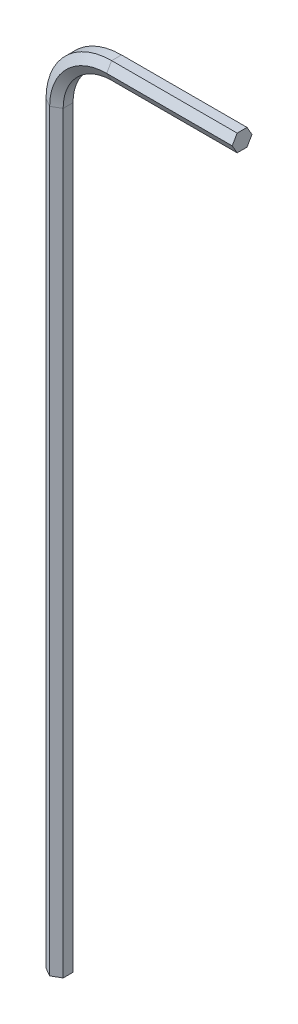
ISO-10303-21;
HEADER;
FILE_DESCRIPTION(('STEP AP214'),'2;1');
FILE_NAME('part.step','',(''),(''),'','','');
FILE_SCHEMA(('AUTOMOTIVE_DESIGN { 1 0 10303 214 1 1 1 1 }'));
ENDSEC;
DATA;
#1=APPLICATION_CONTEXT('core data for automotive mechanical design processes');
#2=APPLICATION_PROTOCOL_DEFINITION('international standard','automotive_design',2000,#1);
#3=PRODUCT_CONTEXT('',#1,'mechanical');
#4=PRODUCT('Part','Part','',(#3));
#5=PRODUCT_RELATED_PRODUCT_CATEGORY('part','',(#4));
#6=PRODUCT_DEFINITION_FORMATION('','',#4);
#7=PRODUCT_DEFINITION_CONTEXT('part definition',#1,'design');
#8=PRODUCT_DEFINITION('design','',#6,#7);
#9=PRODUCT_DEFINITION_SHAPE('','',#8);
#10=(LENGTH_UNIT() NAMED_UNIT(*) SI_UNIT(.MILLI.,.METRE.));
#11=(NAMED_UNIT(*) PLANE_ANGLE_UNIT() SI_UNIT($,.RADIAN.));
#12=(NAMED_UNIT(*) SI_UNIT($,.STERADIAN.) SOLID_ANGLE_UNIT());
#13=UNCERTAINTY_MEASURE_WITH_UNIT(LENGTH_MEASURE(1.E-05),#10,'distance_accuracy_value','');
#14=(GEOMETRIC_REPRESENTATION_CONTEXT(3) GLOBAL_UNCERTAINTY_ASSIGNED_CONTEXT((#13)) GLOBAL_UNIT_ASSIGNED_CONTEXT((#10,
#11,#12)) REPRESENTATION_CONTEXT('',''));
#15=CARTESIAN_POINT('',(0.,0.,0.));
#16=DIRECTION('',(0.,0.,1.));
#17=DIRECTION('',(1.,0.,0.));
#18=AXIS2_PLACEMENT_3D('',#15,#16,#17);
#19=CARTESIAN_POINT('',(0.,0.,0.));
#20=DIRECTION('',(0.,1.,0.));
#21=DIRECTION('',(0.,0.,1.));
#22=AXIS2_PLACEMENT_3D('',#19,#20,#21);
#23=PLANE('',#22);
#24=DIRECTION('',(0.866025403784439,0.,-0.5));
#25=VECTOR('',#24,1.);
#26=CARTESIAN_POINT('',(0.,0.,0.866025403784439));
#27=LINE('',#26,#25);
#28=CARTESIAN_POINT('',(0.,0.,0.866025403784439));
#29=VERTEX_POINT('',#28);
#30=CARTESIAN_POINT('',(0.75,0.,0.433012701892219));
#31=VERTEX_POINT('',#30);
#32=EDGE_CURVE('E183',#29,#31,#27,.T.);
#33=ORIENTED_EDGE('',*,*,#32,.F.);
#34=DIRECTION('',(0.866025403784439,0.,0.5));
#35=VECTOR('',#34,1.);
#36=CARTESIAN_POINT('',(-0.75,0.,0.433012701892219));
#37=LINE('',#36,#35);
#38=CARTESIAN_POINT('',(-0.75,0.,0.433012701892219));
#39=VERTEX_POINT('',#38);
#40=EDGE_CURVE('E225',#39,#29,#37,.T.);
#41=ORIENTED_EDGE('',*,*,#40,.F.);
#42=DIRECTION('',(0.,0.,1.));
#43=VECTOR('',#42,1.);
#44=CARTESIAN_POINT('',(-0.75,0.,-0.43301270189222));
#45=LINE('',#44,#43);
#46=CARTESIAN_POINT('',(-0.75,0.,-0.43301270189222));
#47=VERTEX_POINT('',#46);
#48=EDGE_CURVE('E212',#47,#39,#45,.T.);
#49=ORIENTED_EDGE('',*,*,#48,.F.);
#50=DIRECTION('',(-0.866025403784439,0.,0.5));
#51=VECTOR('',#50,1.);
#52=CARTESIAN_POINT('',(0.,0.,-0.866025403784439));
#53=LINE('',#52,#51);
#54=CARTESIAN_POINT('',(0.,0.,-0.866025403784439));
#55=VERTEX_POINT('',#54);
#56=EDGE_CURVE('E135',#55,#47,#53,.T.);
#57=ORIENTED_EDGE('',*,*,#56,.F.);
#58=DIRECTION('',(-0.866025403784439,0.,-0.5));
#59=VECTOR('',#58,1.);
#60=CARTESIAN_POINT('',(0.75,0.,-0.43301270189222));
#61=LINE('',#60,#59);
#62=CARTESIAN_POINT('',(0.75,0.,-0.43301270189222));
#63=VERTEX_POINT('',#62);
#64=EDGE_CURVE('E139',#63,#55,#61,.T.);
#65=ORIENTED_EDGE('',*,*,#64,.F.);
#66=DIRECTION('',(0.,0.,-1.));
#67=VECTOR('',#66,1.);
#68=CARTESIAN_POINT('',(0.75,0.,0.433012701892219));
#69=LINE('',#68,#67);
#70=EDGE_CURVE('E144',#31,#63,#69,.T.);
#71=ORIENTED_EDGE('',*,*,#70,.F.);
#72=EDGE_LOOP('',(#33,#41,#49,#57,#65,#71));
#73=FACE_BOUND('',#72,.T.);
#74=ADVANCED_FACE('F34',(#73),#23,.F.);
#75=CARTESIAN_POINT('',(16.,71.,0.));
#76=DIRECTION('',(1.,0.,0.));
#77=DIRECTION('',(0.,0.,1.));
#78=AXIS2_PLACEMENT_3D('',#75,#76,#77);
#79=PLANE('',#78);
#80=DIRECTION('',(0.,-0.866025403784439,-0.5));
#81=VECTOR('',#80,1.);
#82=CARTESIAN_POINT('',(16.,71.,0.866025403784439));
#83=LINE('',#82,#81);
#84=CARTESIAN_POINT('',(16.,71.,0.866025403784439));
#85=VERTEX_POINT('',#84);
#86=CARTESIAN_POINT('',(16.,70.25,0.433012701892219));
#87=VERTEX_POINT('',#86);
#88=EDGE_CURVE('E155',#85,#87,#83,.T.);
#89=ORIENTED_EDGE('',*,*,#88,.T.);
#90=DIRECTION('',(0.,0.,-1.));
#91=VECTOR('',#90,1.);
#92=CARTESIAN_POINT('',(16.,70.25,0.433012701892219));
#93=LINE('',#92,#91);
#94=CARTESIAN_POINT('',(16.,70.25,-0.43301270189222));
#95=VERTEX_POINT('',#94);
#96=EDGE_CURVE('E158',#87,#95,#93,.T.);
#97=ORIENTED_EDGE('',*,*,#96,.T.);
#98=DIRECTION('',(0.,0.866025403784439,-0.5));
#99=VECTOR('',#98,1.);
#100=CARTESIAN_POINT('',(16.,70.25,-0.43301270189222));
#101=LINE('',#100,#99);
#102=CARTESIAN_POINT('',(16.,71.,-0.866025403784439));
#103=VERTEX_POINT('',#102);
#104=EDGE_CURVE('E198',#95,#103,#101,.T.);
#105=ORIENTED_EDGE('',*,*,#104,.T.);
#106=DIRECTION('',(0.,0.866025403784439,0.5));
#107=VECTOR('',#106,1.);
#108=CARTESIAN_POINT('',(16.,71.,-0.866025403784439));
#109=LINE('',#108,#107);
#110=CARTESIAN_POINT('',(16.,71.75,-0.43301270189222));
#111=VERTEX_POINT('',#110);
#112=EDGE_CURVE('E53',#103,#111,#109,.T.);
#113=ORIENTED_EDGE('',*,*,#112,.T.);
#114=DIRECTION('',(0.,0.,1.));
#115=VECTOR('',#114,1.);
#116=CARTESIAN_POINT('',(16.,71.75,-0.43301270189222));
#117=LINE('',#116,#115);
#118=CARTESIAN_POINT('',(16.,71.75,0.433012701892219));
#119=VERTEX_POINT('',#118);
#120=EDGE_CURVE('E47',#111,#119,#117,.T.);
#121=ORIENTED_EDGE('',*,*,#120,.T.);
#122=DIRECTION('',(0.,-0.866025403784439,0.5));
#123=VECTOR('',#122,1.);
#124=CARTESIAN_POINT('',(16.,71.75,0.433012701892219));
#125=LINE('',#124,#123);
#126=EDGE_CURVE('E11',#119,#85,#125,.T.);
#127=ORIENTED_EDGE('',*,*,#126,.T.);
#128=EDGE_LOOP('',(#89,#97,#105,#113,#121,#127));
#129=FACE_BOUND('',#128,.T.);
#130=ADVANCED_FACE('F157',(#129),#79,.T.);
#131=CARTESIAN_POINT('',(0.,0.,0.866025403784439));
#132=DIRECTION('',(0.5,0.,0.866025403784439));
#133=DIRECTION('',(0.866025403784439,0.,-0.5));
#134=AXIS2_PLACEMENT_3D('',#131,#132,#133);
#135=PLANE('',#134);
#136=DIRECTION('',(0.,1.,0.));
#137=VECTOR('',#136,1.);
#138=CARTESIAN_POINT('',(0.75,0.,0.433012701892219));
#139=LINE('',#138,#137);
#140=CARTESIAN_POINT('',(0.75,66.,0.433012701892219));
#141=VERTEX_POINT('',#140);
#142=EDGE_CURVE('E188',#31,#141,#139,.T.);
#143=ORIENTED_EDGE('',*,*,#142,.T.);
#144=DIRECTION('',(0.866025403784439,0.,-0.5));
#145=VECTOR('',#144,1.);
#146=CARTESIAN_POINT('',(0.,66.,0.866025403784439));
#147=LINE('',#146,#145);
#148=CARTESIAN_POINT('',(0.,66.,0.866025403784439));
#149=VERTEX_POINT('',#148);
#150=EDGE_CURVE('E257',#149,#141,#147,.T.);
#151=ORIENTED_EDGE('',*,*,#150,.F.);
#152=DIRECTION('',(0.,1.,0.));
#153=VECTOR('',#152,1.);
#154=CARTESIAN_POINT('',(0.,0.,0.866025403784439));
#155=LINE('',#154,#153);
#156=EDGE_CURVE('E239',#29,#149,#155,.T.);
#157=ORIENTED_EDGE('',*,*,#156,.F.);
#158=ORIENTED_EDGE('',*,*,#32,.T.);
#159=EDGE_LOOP('',(#143,#151,#157,#158));
#160=FACE_BOUND('',#159,.T.);
#161=ADVANCED_FACE('F264',(#160),#135,.T.);
#162=CARTESIAN_POINT('',(0.75,0.,0.433012701892219));
#163=DIRECTION('',(1.,0.,0.));
#164=DIRECTION('',(0.,0.,-1.));
#165=AXIS2_PLACEMENT_3D('',#162,#163,#164);
#166=PLANE('',#165);
#167=DIRECTION('',(0.,1.,0.));
#168=VECTOR('',#167,1.);
#169=CARTESIAN_POINT('',(0.75,0.,-0.43301270189222));
#170=LINE('',#169,#168);
#171=CARTESIAN_POINT('',(0.75,66.,-0.43301270189222));
#172=VERTEX_POINT('',#171);
#173=EDGE_CURVE('E187',#63,#172,#170,.T.);
#174=ORIENTED_EDGE('',*,*,#173,.T.);
#175=DIRECTION('',(0.,0.,-1.));
#176=VECTOR('',#175,1.);
#177=CARTESIAN_POINT('',(0.75,66.,0.433012701892219));
#178=LINE('',#177,#176);
#179=EDGE_CURVE('E184',#141,#172,#178,.T.);
#180=ORIENTED_EDGE('',*,*,#179,.F.);
#181=ORIENTED_EDGE('',*,*,#142,.F.);
#182=ORIENTED_EDGE('',*,*,#70,.T.);
#183=EDGE_LOOP('',(#174,#180,#181,#182));
#184=FACE_BOUND('',#183,.T.);
#185=ADVANCED_FACE('F267',(#184),#166,.T.);
#186=CARTESIAN_POINT('',(0.75,0.,-0.43301270189222));
#187=DIRECTION('',(0.5,0.,-0.866025403784439));
#188=DIRECTION('',(-0.866025403784439,0.,-0.5));
#189=AXIS2_PLACEMENT_3D('',#186,#187,#188);
#190=PLANE('',#189);
#191=DIRECTION('',(0.,1.,0.));
#192=VECTOR('',#191,1.);
#193=CARTESIAN_POINT('',(0.,0.,-0.866025403784439));
#194=LINE('',#193,#192);
#195=CARTESIAN_POINT('',(0.,66.,-0.866025403784439));
#196=VERTEX_POINT('',#195);
#197=EDGE_CURVE('E201',#55,#196,#194,.T.);
#198=ORIENTED_EDGE('',*,*,#197,.T.);
#199=DIRECTION('',(-0.866025403784439,0.,-0.5));
#200=VECTOR('',#199,1.);
#201=CARTESIAN_POINT('',(0.75,66.,-0.43301270189222));
#202=LINE('',#201,#200);
#203=EDGE_CURVE('E191',#172,#196,#202,.T.);
#204=ORIENTED_EDGE('',*,*,#203,.F.);
#205=ORIENTED_EDGE('',*,*,#173,.F.);
#206=ORIENTED_EDGE('',*,*,#64,.T.);
#207=EDGE_LOOP('',(#198,#204,#205,#206));
#208=FACE_BOUND('',#207,.T.);
#209=ADVANCED_FACE('F321',(#208),#190,.T.);
#210=CARTESIAN_POINT('',(0.,0.,-0.866025403784439));
#211=DIRECTION('',(-0.5,0.,-0.866025403784439));
#212=DIRECTION('',(-0.866025403784439,0.,0.5));
#213=AXIS2_PLACEMENT_3D('',#210,#211,#212);
#214=PLANE('',#213);
#215=DIRECTION('',(0.,1.,0.));
#216=VECTOR('',#215,1.);
#217=CARTESIAN_POINT('',(-0.75,0.,-0.43301270189222));
#218=LINE('',#217,#216);
#219=CARTESIAN_POINT('',(-0.75,66.,-0.43301270189222));
#220=VERTEX_POINT('',#219);
#221=EDGE_CURVE('E214',#47,#220,#218,.T.);
#222=ORIENTED_EDGE('',*,*,#221,.T.);
#223=DIRECTION('',(-0.866025403784439,0.,0.5));
#224=VECTOR('',#223,1.);
#225=CARTESIAN_POINT('',(0.,66.,-0.866025403784439));
#226=LINE('',#225,#224);
#227=EDGE_CURVE('E204',#196,#220,#226,.T.);
#228=ORIENTED_EDGE('',*,*,#227,.F.);
#229=ORIENTED_EDGE('',*,*,#197,.F.);
#230=ORIENTED_EDGE('',*,*,#56,.T.);
#231=EDGE_LOOP('',(#222,#228,#229,#230));
#232=FACE_BOUND('',#231,.T.);
#233=ADVANCED_FACE('F329',(#232),#214,.T.);
#234=CARTESIAN_POINT('',(-0.75,0.,-0.43301270189222));
#235=DIRECTION('',(-1.,0.,0.));
#236=DIRECTION('',(0.,0.,1.));
#237=AXIS2_PLACEMENT_3D('',#234,#235,#236);
#238=PLANE('',#237);
#239=DIRECTION('',(0.,1.,0.));
#240=VECTOR('',#239,1.);
#241=CARTESIAN_POINT('',(-0.75,0.,0.433012701892219));
#242=LINE('',#241,#240);
#243=CARTESIAN_POINT('',(-0.75,66.,0.433012701892219));
#244=VERTEX_POINT('',#243);
#245=EDGE_CURVE('E227',#39,#244,#242,.T.);
#246=ORIENTED_EDGE('',*,*,#245,.T.);
#247=DIRECTION('',(0.,0.,1.));
#248=VECTOR('',#247,1.);
#249=CARTESIAN_POINT('',(-0.75,66.,-0.43301270189222));
#250=LINE('',#249,#248);
#251=EDGE_CURVE('E217',#220,#244,#250,.T.);
#252=ORIENTED_EDGE('',*,*,#251,.F.);
#253=ORIENTED_EDGE('',*,*,#221,.F.);
#254=ORIENTED_EDGE('',*,*,#48,.T.);
#255=EDGE_LOOP('',(#246,#252,#253,#254));
#256=FACE_BOUND('',#255,.T.);
#257=ADVANCED_FACE('F339',(#256),#238,.T.);
#258=CARTESIAN_POINT('',(-0.75,0.,0.433012701892219));
#259=DIRECTION('',(-0.5,0.,0.866025403784439));
#260=DIRECTION('',(0.866025403784439,0.,0.5));
#261=AXIS2_PLACEMENT_3D('',#258,#259,#260);
#262=PLANE('',#261);
#263=DIRECTION('',(0.866025403784439,0.,0.5));
#264=VECTOR('',#263,1.);
#265=CARTESIAN_POINT('',(-0.75,66.,0.433012701892219));
#266=LINE('',#265,#264);
#267=EDGE_CURVE('E230',#244,#149,#266,.T.);
#268=ORIENTED_EDGE('',*,*,#267,.F.);
#269=ORIENTED_EDGE('',*,*,#245,.F.);
#270=ORIENTED_EDGE('',*,*,#40,.T.);
#271=ORIENTED_EDGE('',*,*,#156,.T.);
#272=EDGE_LOOP('',(#268,#269,#270,#271));
#273=FACE_BOUND('',#272,.T.);
#274=ADVANCED_FACE('F280',(#273),#262,.T.);
#275=CARTESIAN_POINT('',(5.,66.,0.866025403784439));
#276=DIRECTION('',(0.,0.,1.));
#277=DIRECTION('',(1.,0.,0.));
#278=AXIS2_PLACEMENT_3D('',#275,#276,#277);
#279=CONICAL_SURFACE('',#278,5.,1.0471975511966);
#280=CARTESIAN_POINT('',(5.,66.,0.433012701892219));
#281=DIRECTION('',(0.,0.,-1.));
#282=DIRECTION('',(-1.,0.,0.));
#283=AXIS2_PLACEMENT_3D('',#280,#281,#282);
#284=CIRCLE('',#283,4.25);
#285=CARTESIAN_POINT('',(5.00000000000003,70.25,0.433012701892219));
#286=VERTEX_POINT('',#285);
#287=EDGE_CURVE('E194',#141,#286,#284,.T.);
#288=ORIENTED_EDGE('',*,*,#287,.T.);
#289=DIRECTION('',(0.,-0.866025403784439,-0.5));
#290=VECTOR('',#289,1.);
#291=CARTESIAN_POINT('',(5.00000000000003,71.,0.866025403784439));
#292=LINE('',#291,#290);
#293=CARTESIAN_POINT('',(5.00000000000003,71.,0.866025403784439));
#294=VERTEX_POINT('',#293);
#295=EDGE_CURVE('E176',#294,#286,#292,.T.);
#296=ORIENTED_EDGE('',*,*,#295,.F.);
#297=CARTESIAN_POINT('',(5.,66.,0.866025403784439));
#298=DIRECTION('',(0.,0.,-1.));
#299=DIRECTION('',(-1.,0.,0.));
#300=AXIS2_PLACEMENT_3D('',#297,#298,#299);
#301=CIRCLE('',#300,5.);
#302=EDGE_CURVE('E241',#149,#294,#301,.T.);
#303=ORIENTED_EDGE('',*,*,#302,.F.);
#304=ORIENTED_EDGE('',*,*,#150,.T.);
#305=EDGE_LOOP('',(#288,#296,#303,#304));
#306=FACE_BOUND('',#305,.T.);
#307=ADVANCED_FACE('F247',(#306),#279,.F.);
#308=CARTESIAN_POINT('',(5.,66.,0.));
#309=DIRECTION('',(0.,0.,-1.));
#310=DIRECTION('',(-1.,0.,0.));
#311=AXIS2_PLACEMENT_3D('',#308,#309,#310);
#312=CYLINDRICAL_SURFACE('',#311,4.25);
#313=CARTESIAN_POINT('',(5.,66.,-0.43301270189222));
#314=DIRECTION('',(0.,0.,-1.));
#315=DIRECTION('',(-1.,0.,0.));
#316=AXIS2_PLACEMENT_3D('',#313,#314,#315);
#317=CIRCLE('',#316,4.25);
#318=CARTESIAN_POINT('',(5.00000000000003,70.25,-0.43301270189222));
#319=VERTEX_POINT('',#318);
#320=EDGE_CURVE('E122',#172,#319,#317,.T.);
#321=ORIENTED_EDGE('',*,*,#320,.T.);
#322=DIRECTION('',(0.,0.,-1.));
#323=VECTOR('',#322,1.);
#324=CARTESIAN_POINT('',(5.00000000000003,70.25,0.433012701892219));
#325=LINE('',#324,#323);
#326=EDGE_CURVE('E192',#286,#319,#325,.T.);
#327=ORIENTED_EDGE('',*,*,#326,.F.);
#328=ORIENTED_EDGE('',*,*,#287,.F.);
#329=ORIENTED_EDGE('',*,*,#179,.T.);
#330=EDGE_LOOP('',(#321,#327,#328,#329));
#331=FACE_BOUND('',#330,.T.);
#332=ADVANCED_FACE('F270',(#331),#312,.F.);
#333=CARTESIAN_POINT('',(5.,66.,-0.43301270189222));
#334=DIRECTION('',(0.,0.,-1.));
#335=DIRECTION('',(-1.,0.,0.));
#336=AXIS2_PLACEMENT_3D('',#333,#334,#335);
#337=CONICAL_SURFACE('',#336,4.25,1.0471975511966);
#338=CARTESIAN_POINT('',(5.,66.,-0.866025403784439));
#339=DIRECTION('',(0.,0.,-1.));
#340=DIRECTION('',(-1.,0.,0.));
#341=AXIS2_PLACEMENT_3D('',#338,#339,#340);
#342=CIRCLE('',#341,5.);
#343=CARTESIAN_POINT('',(5.00000000000003,71.,-0.866025403784439));
#344=VERTEX_POINT('',#343);
#345=EDGE_CURVE('E113',#196,#344,#342,.T.);
#346=ORIENTED_EDGE('',*,*,#345,.T.);
#347=DIRECTION('',(0.,0.866025403784439,-0.5));
#348=VECTOR('',#347,1.);
#349=CARTESIAN_POINT('',(5.00000000000003,70.25,-0.43301270189222));
#350=LINE('',#349,#348);
#351=EDGE_CURVE('E195',#319,#344,#350,.T.);
#352=ORIENTED_EDGE('',*,*,#351,.F.);
#353=ORIENTED_EDGE('',*,*,#320,.F.);
#354=ORIENTED_EDGE('',*,*,#203,.T.);
#355=EDGE_LOOP('',(#346,#352,#353,#354));
#356=FACE_BOUND('',#355,.T.);
#357=ADVANCED_FACE('F272',(#356),#337,.F.);
#358=CARTESIAN_POINT('',(5.,66.,-0.866025403784439));
#359=DIRECTION('',(0.,0.,1.));
#360=DIRECTION('',(1.,0.,0.));
#361=AXIS2_PLACEMENT_3D('',#358,#359,#360);
#362=CONICAL_SURFACE('',#361,5.,1.0471975511966);
#363=CARTESIAN_POINT('',(5.,66.,-0.43301270189222));
#364=DIRECTION('',(0.,0.,-1.));
#365=DIRECTION('',(-1.,0.,0.));
#366=AXIS2_PLACEMENT_3D('',#363,#364,#365);
#367=CIRCLE('',#366,5.75);
#368=CARTESIAN_POINT('',(5.00000000000004,71.75,-0.43301270189222));
#369=VERTEX_POINT('',#368);
#370=EDGE_CURVE('E106',#220,#369,#367,.T.);
#371=ORIENTED_EDGE('',*,*,#370,.T.);
#372=DIRECTION('',(0.,0.866025403784439,0.5));
#373=VECTOR('',#372,1.);
#374=CARTESIAN_POINT('',(5.00000000000003,71.,-0.866025403784439));
#375=LINE('',#374,#373);
#376=EDGE_CURVE('E208',#344,#369,#375,.T.);
#377=ORIENTED_EDGE('',*,*,#376,.F.);
#378=ORIENTED_EDGE('',*,*,#345,.F.);
#379=ORIENTED_EDGE('',*,*,#227,.T.);
#380=EDGE_LOOP('',(#371,#377,#378,#379));
#381=FACE_BOUND('',#380,.T.);
#382=ADVANCED_FACE('F278',(#381),#362,.T.);
#383=CARTESIAN_POINT('',(5.,66.,0.));
#384=DIRECTION('',(0.,0.,-1.));
#385=DIRECTION('',(-1.,0.,0.));
#386=AXIS2_PLACEMENT_3D('',#383,#384,#385);
#387=CYLINDRICAL_SURFACE('',#386,5.75);
#388=CARTESIAN_POINT('',(5.,66.,0.433012701892219));
#389=DIRECTION('',(0.,0.,-1.));
#390=DIRECTION('',(-1.,0.,0.));
#391=AXIS2_PLACEMENT_3D('',#388,#389,#390);
#392=CIRCLE('',#391,5.75);
#393=CARTESIAN_POINT('',(5.00000000000004,71.75,0.433012701892219));
#394=VERTEX_POINT('',#393);
#395=EDGE_CURVE('E232',#244,#394,#392,.T.);
#396=ORIENTED_EDGE('',*,*,#395,.T.);
#397=DIRECTION('',(0.,0.,1.));
#398=VECTOR('',#397,1.);
#399=CARTESIAN_POINT('',(5.00000000000004,71.75,-0.43301270189222));
#400=LINE('',#399,#398);
#401=EDGE_CURVE('E220',#369,#394,#400,.T.);
#402=ORIENTED_EDGE('',*,*,#401,.F.);
#403=ORIENTED_EDGE('',*,*,#370,.F.);
#404=ORIENTED_EDGE('',*,*,#251,.T.);
#405=EDGE_LOOP('',(#396,#402,#403,#404));
#406=FACE_BOUND('',#405,.T.);
#407=ADVANCED_FACE('F382',(#406),#387,.T.);
#408=CARTESIAN_POINT('',(5.,66.,0.433012701892219));
#409=DIRECTION('',(0.,0.,-1.));
#410=DIRECTION('',(-1.,0.,0.));
#411=AXIS2_PLACEMENT_3D('',#408,#409,#410);
#412=CONICAL_SURFACE('',#411,5.75,1.0471975511966);
#413=DIRECTION('',(0.,-0.866025403784439,0.5));
#414=VECTOR('',#413,1.);
#415=CARTESIAN_POINT('',(5.00000000000004,71.75,0.433012701892219));
#416=LINE('',#415,#414);
#417=EDGE_CURVE('E181',#394,#294,#416,.T.);
#418=ORIENTED_EDGE('',*,*,#417,.F.);
#419=ORIENTED_EDGE('',*,*,#395,.F.);
#420=ORIENTED_EDGE('',*,*,#267,.T.);
#421=ORIENTED_EDGE('',*,*,#302,.T.);
#422=EDGE_LOOP('',(#418,#419,#420,#421));
#423=FACE_BOUND('',#422,.T.);
#424=ADVANCED_FACE('F250',(#423),#412,.T.);
#425=CARTESIAN_POINT('',(5.00000000000003,71.,0.866025403784439));
#426=DIRECTION('',(0.,-0.5,0.866025403784439));
#427=DIRECTION('',(0.,-0.866025403784439,-0.5));
#428=AXIS2_PLACEMENT_3D('',#425,#426,#427);
#429=PLANE('',#428);
#430=DIRECTION('',(1.,0.,0.));
#431=VECTOR('',#430,1.);
#432=CARTESIAN_POINT('',(5.00000000000003,70.25,0.433012701892219));
#433=LINE('',#432,#431);
#434=EDGE_CURVE('E163',#286,#87,#433,.T.);
#435=ORIENTED_EDGE('',*,*,#434,.T.);
#436=ORIENTED_EDGE('',*,*,#88,.F.);
#437=DIRECTION('',(1.,0.,0.));
#438=VECTOR('',#437,1.);
#439=CARTESIAN_POINT('',(5.00000000000003,71.,0.866025403784439));
#440=LINE('',#439,#438);
#441=EDGE_CURVE('E164',#294,#85,#440,.T.);
#442=ORIENTED_EDGE('',*,*,#441,.F.);
#443=ORIENTED_EDGE('',*,*,#295,.T.);
#444=EDGE_LOOP('',(#435,#436,#442,#443));
#445=FACE_BOUND('',#444,.T.);
#446=ADVANCED_FACE('F174',(#445),#429,.T.);
#447=CARTESIAN_POINT('',(5.00000000000003,70.25,0.433012701892219));
#448=DIRECTION('',(0.,-1.,0.));
#449=DIRECTION('',(0.,0.,-1.));
#450=AXIS2_PLACEMENT_3D('',#447,#448,#449);
#451=PLANE('',#450);
#452=DIRECTION('',(1.,0.,0.));
#453=VECTOR('',#452,1.);
#454=CARTESIAN_POINT('',(5.00000000000003,70.25,-0.43301270189222));
#455=LINE('',#454,#453);
#456=EDGE_CURVE('E171',#319,#95,#455,.T.);
#457=ORIENTED_EDGE('',*,*,#456,.T.);
#458=ORIENTED_EDGE('',*,*,#96,.F.);
#459=ORIENTED_EDGE('',*,*,#434,.F.);
#460=ORIENTED_EDGE('',*,*,#326,.T.);
#461=EDGE_LOOP('',(#457,#458,#459,#460));
#462=FACE_BOUND('',#461,.T.);
#463=ADVANCED_FACE('F168',(#462),#451,.T.);
#464=CARTESIAN_POINT('',(5.00000000000003,70.25,-0.43301270189222));
#465=DIRECTION('',(0.,-0.5,-0.866025403784439));
#466=DIRECTION('',(0.,0.866025403784439,-0.5));
#467=AXIS2_PLACEMENT_3D('',#464,#465,#466);
#468=PLANE('',#467);
#469=DIRECTION('',(1.,0.,0.));
#470=VECTOR('',#469,1.);
#471=CARTESIAN_POINT('',(5.00000000000003,71.,-0.866025403784439));
#472=LINE('',#471,#470);
#473=EDGE_CURVE('E91',#344,#103,#472,.T.);
#474=ORIENTED_EDGE('',*,*,#473,.T.);
#475=ORIENTED_EDGE('',*,*,#104,.F.);
#476=ORIENTED_EDGE('',*,*,#456,.F.);
#477=ORIENTED_EDGE('',*,*,#351,.T.);
#478=EDGE_LOOP('',(#474,#475,#476,#477));
#479=FACE_BOUND('',#478,.T.);
#480=ADVANCED_FACE('F414',(#479),#468,.T.);
#481=CARTESIAN_POINT('',(5.00000000000003,71.,-0.866025403784439));
#482=DIRECTION('',(0.,0.5,-0.866025403784439));
#483=DIRECTION('',(0.,0.866025403784439,0.5));
#484=AXIS2_PLACEMENT_3D('',#481,#482,#483);
#485=PLANE('',#484);
#486=DIRECTION('',(1.,0.,0.));
#487=VECTOR('',#486,1.);
#488=CARTESIAN_POINT('',(5.00000000000003,71.75,-0.43301270189222));
#489=LINE('',#488,#487);
#490=EDGE_CURVE('E83',#369,#111,#489,.T.);
#491=ORIENTED_EDGE('',*,*,#490,.T.);
#492=ORIENTED_EDGE('',*,*,#112,.F.);
#493=ORIENTED_EDGE('',*,*,#473,.F.);
#494=ORIENTED_EDGE('',*,*,#376,.T.);
#495=EDGE_LOOP('',(#491,#492,#493,#494));
#496=FACE_BOUND('',#495,.T.);
#497=ADVANCED_FACE('F290',(#496),#485,.T.);
#498=CARTESIAN_POINT('',(5.00000000000003,71.75,-0.43301270189222));
#499=DIRECTION('',(0.,1.,0.));
#500=DIRECTION('',(0.,0.,1.));
#501=AXIS2_PLACEMENT_3D('',#498,#499,#500);
#502=PLANE('',#501);
#503=DIRECTION('',(1.,0.,0.));
#504=VECTOR('',#503,1.);
#505=CARTESIAN_POINT('',(5.00000000000003,71.75,0.433012701892219));
#506=LINE('',#505,#504);
#507=EDGE_CURVE('E41',#394,#119,#506,.T.);
#508=ORIENTED_EDGE('',*,*,#507,.T.);
#509=ORIENTED_EDGE('',*,*,#120,.F.);
#510=ORIENTED_EDGE('',*,*,#490,.F.);
#511=ORIENTED_EDGE('',*,*,#401,.T.);
#512=EDGE_LOOP('',(#508,#509,#510,#511));
#513=FACE_BOUND('',#512,.T.);
#514=ADVANCED_FACE('F285',(#513),#502,.T.);
#515=CARTESIAN_POINT('',(5.00000000000003,71.75,0.433012701892219));
#516=DIRECTION('',(0.,0.5,0.866025403784439));
#517=DIRECTION('',(0.,-0.866025403784439,0.5));
#518=AXIS2_PLACEMENT_3D('',#515,#516,#517);
#519=PLANE('',#518);
#520=ORIENTED_EDGE('',*,*,#126,.F.);
#521=ORIENTED_EDGE('',*,*,#507,.F.);
#522=ORIENTED_EDGE('',*,*,#417,.T.);
#523=ORIENTED_EDGE('',*,*,#441,.T.);
#524=EDGE_LOOP('',(#520,#521,#522,#523));
#525=FACE_BOUND('',#524,.T.);
#526=ADVANCED_FACE('F242',(#525),#519,.T.);
#527=CLOSED_SHELL('',(#74,#130,#161,#185,#209,#233,#257,#274,#307,#332,#357,#382,#407,#424,#446,
#463,#480,#497,#514,#526));
#528=MANIFOLD_SOLID_BREP('B2',#527);
#529=ADVANCED_BREP_SHAPE_REPRESENTATION('',(#18,#528),#14);
#530=SHAPE_DEFINITION_REPRESENTATION(#9,#529);
ENDSEC;
END-ISO-10303-21;
